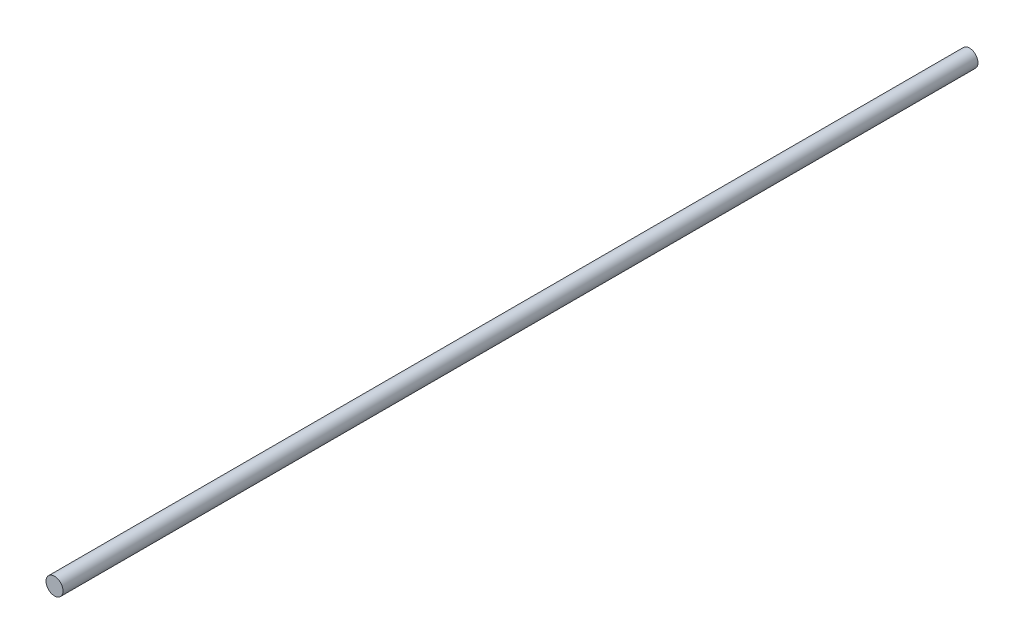
ISO-10303-21;
HEADER;
FILE_DESCRIPTION(('STEP AP214'),'2;1');
FILE_NAME('part.step','',(''),(''),'','','');
FILE_SCHEMA(('AUTOMOTIVE_DESIGN { 1 0 10303 214 1 1 1 1 }'));
ENDSEC;
DATA;
#1=APPLICATION_CONTEXT('core data for automotive mechanical design processes');
#2=APPLICATION_PROTOCOL_DEFINITION('international standard','automotive_design',2000,#1);
#3=PRODUCT_CONTEXT('',#1,'mechanical');
#4=PRODUCT('Part','Part','',(#3));
#5=PRODUCT_RELATED_PRODUCT_CATEGORY('part','',(#4));
#6=PRODUCT_DEFINITION_FORMATION('','',#4);
#7=PRODUCT_DEFINITION_CONTEXT('part definition',#1,'design');
#8=PRODUCT_DEFINITION('design','',#6,#7);
#9=PRODUCT_DEFINITION_SHAPE('','',#8);
#10=(LENGTH_UNIT() NAMED_UNIT(*) SI_UNIT(.MILLI.,.METRE.));
#11=(NAMED_UNIT(*) PLANE_ANGLE_UNIT() SI_UNIT($,.RADIAN.));
#12=(NAMED_UNIT(*) SI_UNIT($,.STERADIAN.) SOLID_ANGLE_UNIT());
#13=UNCERTAINTY_MEASURE_WITH_UNIT(LENGTH_MEASURE(1.E-05),#10,'distance_accuracy_value','');
#14=(GEOMETRIC_REPRESENTATION_CONTEXT(3) GLOBAL_UNCERTAINTY_ASSIGNED_CONTEXT((#13)) GLOBAL_UNIT_ASSIGNED_CONTEXT((#10,
#11,#12)) REPRESENTATION_CONTEXT('',''));
#15=CARTESIAN_POINT('',(0.,0.,0.));
#16=DIRECTION('',(0.,0.,1.));
#17=DIRECTION('',(1.,0.,0.));
#18=AXIS2_PLACEMENT_3D('',#15,#16,#17);
#19=CARTESIAN_POINT('',(0.,0.,322.));
#20=DIRECTION('',(0.,0.,-1.));
#21=DIRECTION('',(-1.,0.,0.));
#22=AXIS2_PLACEMENT_3D('',#19,#20,#21);
#23=CYLINDRICAL_SURFACE('',#22,3.);
#24=CARTESIAN_POINT('',(0.,0.,322.));
#25=DIRECTION('',(0.,0.,1.));
#26=DIRECTION('',(1.,0.,0.));
#27=AXIS2_PLACEMENT_3D('',#24,#25,#26);
#28=CIRCLE('',#27,3.);
#29=CARTESIAN_POINT('',(3.,0.,322.));
#30=VERTEX_POINT('',#29);
#31=EDGE_CURVE('E10',#30,#30,#28,.T.);
#32=ORIENTED_EDGE('',*,*,#31,.F.);
#33=EDGE_LOOP('',(#32));
#34=FACE_BOUND('',#33,.T.);
#35=CARTESIAN_POINT('',(0.,0.,0.));
#36=DIRECTION('',(0.,0.,1.));
#37=DIRECTION('',(1.,0.,0.));
#38=AXIS2_PLACEMENT_3D('',#35,#36,#37);
#39=CIRCLE('',#38,3.);
#40=CARTESIAN_POINT('',(3.,0.,0.));
#41=VERTEX_POINT('',#40);
#42=EDGE_CURVE('E46',#41,#41,#39,.T.);
#43=ORIENTED_EDGE('',*,*,#42,.T.);
#44=EDGE_LOOP('',(#43));
#45=FACE_BOUND('',#44,.T.);
#46=ADVANCED_FACE('F43',(#34,#45),#23,.T.);
#47=CARTESIAN_POINT('',(0.,0.,322.));
#48=DIRECTION('',(0.,0.,1.));
#49=DIRECTION('',(1.,0.,0.));
#50=AXIS2_PLACEMENT_3D('',#47,#48,#49);
#51=PLANE('',#50);
#52=ORIENTED_EDGE('',*,*,#31,.T.);
#53=EDGE_LOOP('',(#52));
#54=FACE_BOUND('',#53,.T.);
#55=ADVANCED_FACE('F60',(#54),#51,.T.);
#56=CARTESIAN_POINT('',(0.,0.,0.));
#57=DIRECTION('',(0.,0.,1.));
#58=DIRECTION('',(1.,0.,0.));
#59=AXIS2_PLACEMENT_3D('',#56,#57,#58);
#60=PLANE('',#59);
#61=ORIENTED_EDGE('',*,*,#42,.F.);
#62=EDGE_LOOP('',(#61));
#63=FACE_BOUND('',#62,.T.);
#64=ADVANCED_FACE('F58',(#63),#60,.F.);
#65=CLOSED_SHELL('',(#46,#55,#64));
#66=MANIFOLD_SOLID_BREP('B2',#65);
#67=ADVANCED_BREP_SHAPE_REPRESENTATION('',(#18,#66),#14);
#68=SHAPE_DEFINITION_REPRESENTATION(#9,#67);
ENDSEC;
END-ISO-10303-21;
